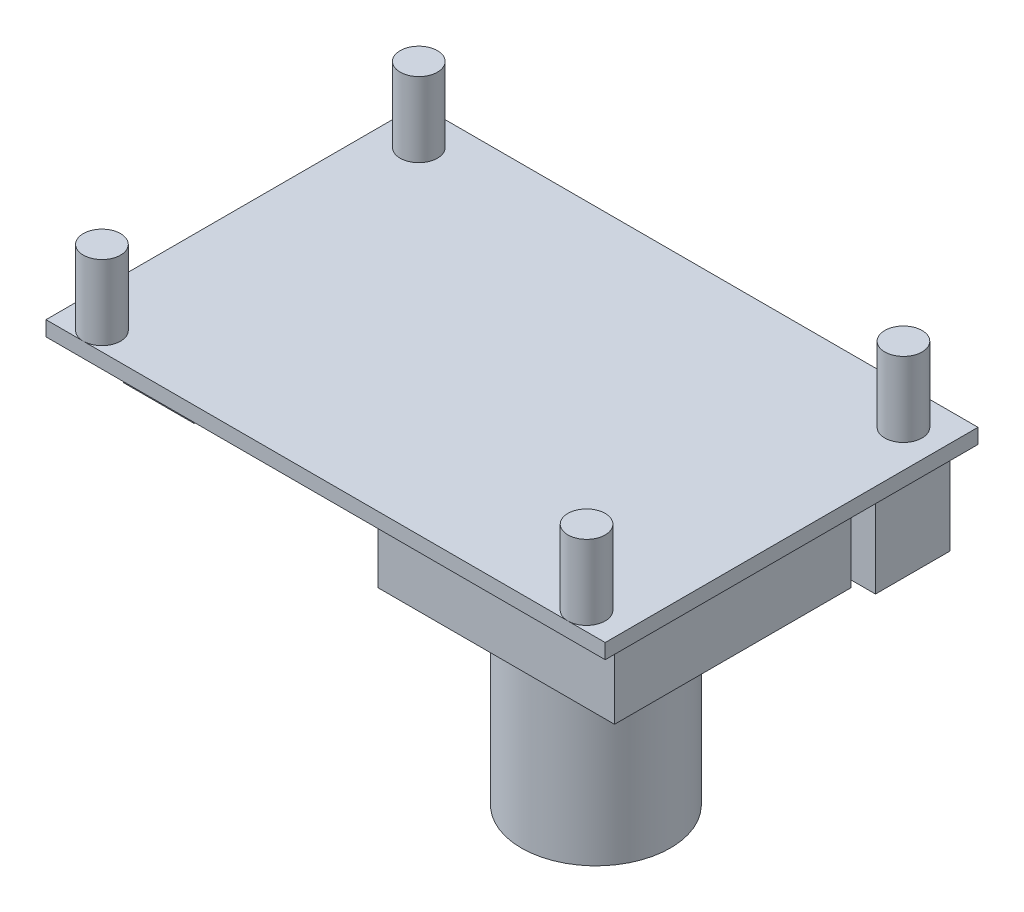
ISO-10303-21;
HEADER;
FILE_DESCRIPTION(('STEP AP214'),'2;1');
FILE_NAME('part.step','',(''),(''),'','','');
FILE_SCHEMA(('AUTOMOTIVE_DESIGN { 1 0 10303 214 1 1 1 1 }'));
ENDSEC;
DATA;
#1=APPLICATION_CONTEXT('core data for automotive mechanical design processes');
#2=APPLICATION_PROTOCOL_DEFINITION('international standard','automotive_design',2000,#1);
#3=PRODUCT_CONTEXT('',#1,'mechanical');
#4=PRODUCT('Part','Part','',(#3));
#5=PRODUCT_RELATED_PRODUCT_CATEGORY('part','',(#4));
#6=PRODUCT_DEFINITION_FORMATION('','',#4);
#7=PRODUCT_DEFINITION_CONTEXT('part definition',#1,'design');
#8=PRODUCT_DEFINITION('design','',#6,#7);
#9=PRODUCT_DEFINITION_SHAPE('','',#8);
#10=(LENGTH_UNIT() NAMED_UNIT(*) SI_UNIT(.MILLI.,.METRE.));
#11=(NAMED_UNIT(*) PLANE_ANGLE_UNIT() SI_UNIT($,.RADIAN.));
#12=(NAMED_UNIT(*) SI_UNIT($,.STERADIAN.) SOLID_ANGLE_UNIT());
#13=UNCERTAINTY_MEASURE_WITH_UNIT(LENGTH_MEASURE(1.E-05),#10,'distance_accuracy_value','');
#14=(GEOMETRIC_REPRESENTATION_CONTEXT(3) GLOBAL_UNCERTAINTY_ASSIGNED_CONTEXT((#13)) GLOBAL_UNIT_ASSIGNED_CONTEXT((#10,
#11,#12)) REPRESENTATION_CONTEXT('',''));
#15=CARTESIAN_POINT('',(0.,0.,0.));
#16=DIRECTION('',(0.,0.,1.));
#17=DIRECTION('',(1.,0.,0.));
#18=AXIS2_PLACEMENT_3D('',#15,#16,#17);
#19=CARTESIAN_POINT('',(-28.,27.,16.));
#20=DIRECTION('',(0.,0.,-1.));
#21=DIRECTION('',(-1.,0.,0.));
#22=AXIS2_PLACEMENT_3D('',#19,#20,#21);
#23=PLANE('',#22);
#24=DIRECTION('',(0.,-1.,0.));
#25=VECTOR('',#24,1.);
#26=CARTESIAN_POINT('',(-24.,27.,16.));
#27=LINE('',#26,#25);
#28=CARTESIAN_POINT('',(-24.,27.,16.));
#29=VERTEX_POINT('',#28);
#30=CARTESIAN_POINT('',(-24.,24.6,16.));
#31=VERTEX_POINT('',#30);
#32=EDGE_CURVE('E51',#29,#31,#27,.T.);
#33=ORIENTED_EDGE('',*,*,#32,.F.);
#34=DIRECTION('',(1.,0.,0.));
#35=VECTOR('',#34,1.);
#36=CARTESIAN_POINT('',(-28.,27.,16.));
#37=LINE('',#36,#35);
#38=CARTESIAN_POINT('',(-28.,27.,16.));
#39=VERTEX_POINT('',#38);
#40=EDGE_CURVE('E332',#39,#29,#37,.T.);
#41=ORIENTED_EDGE('',*,*,#40,.F.);
#42=DIRECTION('',(0.,-1.,0.));
#43=VECTOR('',#42,1.);
#44=CARTESIAN_POINT('',(-28.,27.,16.));
#45=LINE('',#44,#43);
#46=CARTESIAN_POINT('',(-28.,24.3,16.));
#47=VERTEX_POINT('',#46);
#48=EDGE_CURVE('E352',#39,#47,#45,.T.);
#49=ORIENTED_EDGE('',*,*,#48,.T.);
#50=DIRECTION('',(1.,0.,0.));
#51=VECTOR('',#50,1.);
#52=CARTESIAN_POINT('',(-28.,24.3,16.));
#53=LINE('',#52,#51);
#54=CARTESIAN_POINT('',(-5.1,24.3,16.));
#55=VERTEX_POINT('',#54);
#56=EDGE_CURVE('E345',#47,#55,#53,.T.);
#57=ORIENTED_EDGE('',*,*,#56,.T.);
#58=DIRECTION('',(0.,-1.,0.));
#59=VECTOR('',#58,1.);
#60=CARTESIAN_POINT('',(-5.1,27.,16.));
#61=LINE('',#60,#59);
#62=CARTESIAN_POINT('',(-5.1,27.,16.));
#63=VERTEX_POINT('',#62);
#64=EDGE_CURVE('E355',#63,#55,#61,.T.);
#65=ORIENTED_EDGE('',*,*,#64,.F.);
#66=CARTESIAN_POINT('',(-16.4,27.,16.));
#67=VERTEX_POINT('',#66);
#68=EDGE_CURVE('E328',#67,#63,#37,.T.);
#69=ORIENTED_EDGE('',*,*,#68,.F.);
#70=DIRECTION('',(0.,1.,0.));
#71=VECTOR('',#70,1.);
#72=CARTESIAN_POINT('',(-16.4,27.,16.));
#73=LINE('',#72,#71);
#74=CARTESIAN_POINT('',(-16.4,24.6,16.));
#75=VERTEX_POINT('',#74);
#76=EDGE_CURVE('E413',#75,#67,#73,.T.);
#77=ORIENTED_EDGE('',*,*,#76,.F.);
#78=DIRECTION('',(1.,0.,0.));
#79=VECTOR('',#78,1.);
#80=CARTESIAN_POINT('',(-28.,24.6,16.));
#81=LINE('',#80,#79);
#82=EDGE_CURVE('E412',#31,#75,#81,.T.);
#83=ORIENTED_EDGE('',*,*,#82,.F.);
#84=EDGE_LOOP('',(#33,#41,#49,#57,#65,#69,#77,#83));
#85=FACE_BOUND('',#84,.T.);
#86=ADVANCED_FACE('F43',(#85),#23,.F.);
#87=CARTESIAN_POINT('',(0.,27.,0.));
#88=DIRECTION('',(0.,1.,0.));
#89=DIRECTION('',(0.,0.,1.));
#90=AXIS2_PLACEMENT_3D('',#87,#88,#89);
#91=PLANE('',#90);
#92=ORIENTED_EDGE('',*,*,#40,.T.);
#93=DIRECTION('',(0.,0.,1.));
#94=VECTOR('',#93,1.);
#95=CARTESIAN_POINT('',(-24.,27.,5.));
#96=LINE('',#95,#94);
#97=CARTESIAN_POINT('',(-24.,27.,17.7));
#98=VERTEX_POINT('',#97);
#99=EDGE_CURVE('E59',#29,#98,#96,.T.);
#100=ORIENTED_EDGE('',*,*,#99,.T.);
#101=DIRECTION('',(1.,0.,0.));
#102=VECTOR('',#101,1.);
#103=CARTESIAN_POINT('',(-24.,27.,17.7));
#104=LINE('',#103,#102);
#105=CARTESIAN_POINT('',(-16.4,27.,17.7));
#106=VERTEX_POINT('',#105);
#107=EDGE_CURVE('E65',#98,#106,#104,.T.);
#108=ORIENTED_EDGE('',*,*,#107,.T.);
#109=DIRECTION('',(0.,0.,-1.));
#110=VECTOR('',#109,1.);
#111=CARTESIAN_POINT('',(-16.4,27.,17.7));
#112=LINE('',#111,#110);
#113=EDGE_CURVE('E231',#106,#67,#112,.T.);
#114=ORIENTED_EDGE('',*,*,#113,.T.);
#115=ORIENTED_EDGE('',*,*,#68,.T.);
#116=DIRECTION('',(0.,0.,-1.));
#117=VECTOR('',#116,1.);
#118=CARTESIAN_POINT('',(-5.1,27.,16.));
#119=LINE('',#118,#117);
#120=CARTESIAN_POINT('',(-5.1,27.,-7.));
#121=VERTEX_POINT('',#120);
#122=EDGE_CURVE('E334',#63,#121,#119,.T.);
#123=ORIENTED_EDGE('',*,*,#122,.T.);
#124=DIRECTION('',(-1.,0.,0.));
#125=VECTOR('',#124,1.);
#126=CARTESIAN_POINT('',(-5.1,27.,-7.));
#127=LINE('',#126,#125);
#128=CARTESIAN_POINT('',(-28.,27.,-7.));
#129=VERTEX_POINT('',#128);
#130=EDGE_CURVE('E338',#121,#129,#127,.T.);
#131=ORIENTED_EDGE('',*,*,#130,.T.);
#132=DIRECTION('',(0.,0.,1.));
#133=VECTOR('',#132,1.);
#134=CARTESIAN_POINT('',(-28.,27.,-7.));
#135=LINE('',#134,#133);
#136=EDGE_CURVE('E326',#129,#39,#135,.T.);
#137=ORIENTED_EDGE('',*,*,#136,.T.);
#138=EDGE_LOOP('',(#92,#100,#108,#114,#115,#123,#131,#137));
#139=FACE_BOUND('',#138,.T.);
#140=DIRECTION('',(0.,0.,1.));
#141=VECTOR('',#140,1.);
#142=CARTESIAN_POINT('',(1.6,27.,-9.4));
#143=LINE('',#142,#141);
#144=CARTESIAN_POINT('',(1.6,27.,-9.4));
#145=VERTEX_POINT('',#144);
#146=CARTESIAN_POINT('',(1.6,27.,16.));
#147=VERTEX_POINT('',#146);
#148=EDGE_CURVE('E262',#145,#147,#143,.T.);
#149=ORIENTED_EDGE('',*,*,#148,.T.);
#150=DIRECTION('',(1.,0.,0.));
#151=VECTOR('',#150,1.);
#152=CARTESIAN_POINT('',(1.6,27.,16.));
#153=LINE('',#152,#151);
#154=CARTESIAN_POINT('',(27.,27.,16.));
#155=VERTEX_POINT('',#154);
#156=EDGE_CURVE('E266',#147,#155,#153,.T.);
#157=ORIENTED_EDGE('',*,*,#156,.T.);
#158=DIRECTION('',(0.,0.,-1.));
#159=VECTOR('',#158,1.);
#160=CARTESIAN_POINT('',(27.,27.,16.));
#161=LINE('',#160,#159);
#162=CARTESIAN_POINT('',(27.,27.,-9.4));
#163=VERTEX_POINT('',#162);
#164=EDGE_CURVE('E267',#155,#163,#161,.T.);
#165=ORIENTED_EDGE('',*,*,#164,.T.);
#166=DIRECTION('',(-1.,0.,0.));
#167=VECTOR('',#166,1.);
#168=CARTESIAN_POINT('',(27.,27.,-9.4));
#169=LINE('',#168,#167);
#170=EDGE_CURVE('E271',#163,#145,#169,.T.);
#171=ORIENTED_EDGE('',*,*,#170,.T.);
#172=EDGE_LOOP('',(#149,#157,#165,#171));
#173=FACE_BOUND('',#172,.T.);
#174=DIRECTION('',(0.,0.,1.));
#175=VECTOR('',#174,1.);
#176=CARTESIAN_POINT('',(-30.,27.,-20.));
#177=LINE('',#176,#175);
#178=CARTESIAN_POINT('',(-30.,27.,-20.));
#179=VERTEX_POINT('',#178);
#180=CARTESIAN_POINT('',(-30.,27.,20.));
#181=VERTEX_POINT('',#180);
#182=EDGE_CURVE('E373',#179,#181,#177,.T.);
#183=ORIENTED_EDGE('',*,*,#182,.F.);
#184=DIRECTION('',(-1.,0.,0.));
#185=VECTOR('',#184,1.);
#186=CARTESIAN_POINT('',(30.,27.,-20.));
#187=LINE('',#186,#185);
#188=CARTESIAN_POINT('',(30.,27.,-20.));
#189=VERTEX_POINT('',#188);
#190=EDGE_CURVE('E379',#189,#179,#187,.T.);
#191=ORIENTED_EDGE('',*,*,#190,.F.);
#192=DIRECTION('',(0.,0.,-1.));
#193=VECTOR('',#192,1.);
#194=CARTESIAN_POINT('',(30.,27.,20.));
#195=LINE('',#194,#193);
#196=CARTESIAN_POINT('',(30.,27.,20.));
#197=VERTEX_POINT('',#196);
#198=EDGE_CURVE('E391',#197,#189,#195,.T.);
#199=ORIENTED_EDGE('',*,*,#198,.F.);
#200=DIRECTION('',(1.,0.,0.));
#201=VECTOR('',#200,1.);
#202=CARTESIAN_POINT('',(-30.,27.,20.));
#203=LINE('',#202,#201);
#204=EDGE_CURVE('E393',#181,#197,#203,.T.);
#205=ORIENTED_EDGE('',*,*,#204,.F.);
#206=EDGE_LOOP('',(#183,#191,#199,#205));
#207=FACE_BOUND('',#206,.T.);
#208=DIRECTION('',(0.,0.,1.));
#209=VECTOR('',#208,1.);
#210=CARTESIAN_POINT('',(-28.,27.,-19.));
#211=LINE('',#210,#209);
#212=CARTESIAN_POINT('',(-28.,27.,-19.));
#213=VERTEX_POINT('',#212);
#214=CARTESIAN_POINT('',(-28.,27.,-11.));
#215=VERTEX_POINT('',#214);
#216=EDGE_CURVE('E236',#213,#215,#211,.T.);
#217=ORIENTED_EDGE('',*,*,#216,.T.);
#218=DIRECTION('',(1.,0.,0.));
#219=VECTOR('',#218,1.);
#220=CARTESIAN_POINT('',(-28.,27.,-11.));
#221=LINE('',#220,#219);
#222=CARTESIAN_POINT('',(28.,27.,-11.));
#223=VERTEX_POINT('',#222);
#224=EDGE_CURVE('E238',#215,#223,#221,.T.);
#225=ORIENTED_EDGE('',*,*,#224,.T.);
#226=DIRECTION('',(0.,0.,-1.));
#227=VECTOR('',#226,1.);
#228=CARTESIAN_POINT('',(28.,27.,-11.));
#229=LINE('',#228,#227);
#230=CARTESIAN_POINT('',(28.,27.,-19.));
#231=VERTEX_POINT('',#230);
#232=EDGE_CURVE('E241',#223,#231,#229,.T.);
#233=ORIENTED_EDGE('',*,*,#232,.T.);
#234=DIRECTION('',(-1.,0.,0.));
#235=VECTOR('',#234,1.);
#236=CARTESIAN_POINT('',(28.,27.,-19.));
#237=LINE('',#236,#235);
#238=EDGE_CURVE('E242',#231,#213,#237,.T.);
#239=ORIENTED_EDGE('',*,*,#238,.T.);
#240=EDGE_LOOP('',(#217,#225,#233,#239));
#241=FACE_BOUND('',#240,.T.);
#242=ADVANCED_FACE('F424',(#139,#173,#207,#241),#91,.F.);
#243=CARTESIAN_POINT('',(-26.,36.6,18.));
#244=DIRECTION('',(0.,-1.,0.));
#245=DIRECTION('',(0.,0.,-1.));
#246=AXIS2_PLACEMENT_3D('',#243,#244,#245);
#247=CYLINDRICAL_SURFACE('',#246,2.);
#248=CARTESIAN_POINT('',(-26.,36.6,18.));
#249=DIRECTION('',(0.,1.,0.));
#250=DIRECTION('',(0.,0.,1.));
#251=AXIS2_PLACEMENT_3D('',#248,#249,#250);
#252=CIRCLE('',#251,2.);
#253=CARTESIAN_POINT('',(-26.,36.6,20.));
#254=VERTEX_POINT('',#253);
#255=EDGE_CURVE('E406',#254,#254,#252,.T.);
#256=ORIENTED_EDGE('',*,*,#255,.F.);
#257=EDGE_LOOP('',(#256));
#258=FACE_BOUND('',#257,.T.);
#259=CARTESIAN_POINT('',(-26.,28.6,18.));
#260=DIRECTION('',(0.,1.,0.));
#261=DIRECTION('',(0.,0.,1.));
#262=AXIS2_PLACEMENT_3D('',#259,#260,#261);
#263=CIRCLE('',#262,2.);
#264=CARTESIAN_POINT('',(-26.,28.6,20.));
#265=VERTEX_POINT('',#264);
#266=EDGE_CURVE('E410',#265,#265,#263,.T.);
#267=ORIENTED_EDGE('',*,*,#266,.T.);
#268=EDGE_LOOP('',(#267));
#269=FACE_BOUND('',#268,.T.);
#270=ADVANCED_FACE('F44',(#258,#269),#247,.T.);
#271=CARTESIAN_POINT('',(-26.,36.6,18.));
#272=DIRECTION('',(0.,1.,0.));
#273=DIRECTION('',(0.,0.,1.));
#274=AXIS2_PLACEMENT_3D('',#271,#272,#273);
#275=PLANE('',#274);
#276=ORIENTED_EDGE('',*,*,#255,.T.);
#277=EDGE_LOOP('',(#276));
#278=FACE_BOUND('',#277,.T.);
#279=ADVANCED_FACE('F484',(#278),#275,.T.);
#280=CARTESIAN_POINT('',(0.,28.6,0.));
#281=DIRECTION('',(0.,1.,0.));
#282=DIRECTION('',(0.,0.,1.));
#283=AXIS2_PLACEMENT_3D('',#280,#281,#282);
#284=PLANE('',#283);
#285=CARTESIAN_POINT('',(26.,28.6,-16.));
#286=DIRECTION('',(0.,1.,0.));
#287=DIRECTION('',(0.,0.,1.));
#288=AXIS2_PLACEMENT_3D('',#285,#286,#287);
#289=CIRCLE('',#288,2.);
#290=CARTESIAN_POINT('',(26.,28.6,-14.));
#291=VERTEX_POINT('',#290);
#292=EDGE_CURVE('E359',#291,#291,#289,.T.);
#293=ORIENTED_EDGE('',*,*,#292,.F.);
#294=EDGE_LOOP('',(#293));
#295=FACE_BOUND('',#294,.T.);
#296=CARTESIAN_POINT('',(-26.,28.6,-16.));
#297=DIRECTION('',(0.,1.,0.));
#298=DIRECTION('',(0.,0.,1.));
#299=AXIS2_PLACEMENT_3D('',#296,#297,#298);
#300=CIRCLE('',#299,2.);
#301=CARTESIAN_POINT('',(-26.,28.6,-14.));
#302=VERTEX_POINT('',#301);
#303=EDGE_CURVE('E366',#302,#302,#300,.T.);
#304=ORIENTED_EDGE('',*,*,#303,.F.);
#305=EDGE_LOOP('',(#304));
#306=FACE_BOUND('',#305,.T.);
#307=DIRECTION('',(1.,0.,0.));
#308=VECTOR('',#307,1.);
#309=CARTESIAN_POINT('',(-30.,28.6,20.));
#310=LINE('',#309,#308);
#311=CARTESIAN_POINT('',(26.,28.6,20.));
#312=VERTEX_POINT('',#311);
#313=EDGE_CURVE('E383',#265,#312,#310,.T.);
#314=ORIENTED_EDGE('',*,*,#313,.T.);
#315=CARTESIAN_POINT('',(26.,28.6,18.));
#316=DIRECTION('',(0.,1.,0.));
#317=DIRECTION('',(0.,0.,1.));
#318=AXIS2_PLACEMENT_3D('',#315,#316,#317);
#319=CIRCLE('',#318,2.);
#320=EDGE_CURVE('E362',#312,#312,#319,.T.);
#321=ORIENTED_EDGE('',*,*,#320,.F.);
#322=CARTESIAN_POINT('',(30.,28.6,20.));
#323=VERTEX_POINT('',#322);
#324=EDGE_CURVE('E377',#312,#323,#310,.T.);
#325=ORIENTED_EDGE('',*,*,#324,.T.);
#326=DIRECTION('',(0.,0.,-1.));
#327=VECTOR('',#326,1.);
#328=CARTESIAN_POINT('',(30.,28.6,20.));
#329=LINE('',#328,#327);
#330=CARTESIAN_POINT('',(30.,28.6,-20.));
#331=VERTEX_POINT('',#330);
#332=EDGE_CURVE('E382',#323,#331,#329,.T.);
#333=ORIENTED_EDGE('',*,*,#332,.T.);
#334=DIRECTION('',(-1.,0.,0.));
#335=VECTOR('',#334,1.);
#336=CARTESIAN_POINT('',(30.,28.6,-20.));
#337=LINE('',#336,#335);
#338=CARTESIAN_POINT('',(-30.,28.6,-20.));
#339=VERTEX_POINT('',#338);
#340=EDGE_CURVE('E387',#331,#339,#337,.T.);
#341=ORIENTED_EDGE('',*,*,#340,.T.);
#342=DIRECTION('',(0.,0.,1.));
#343=VECTOR('',#342,1.);
#344=CARTESIAN_POINT('',(-30.,28.6,-20.));
#345=LINE('',#344,#343);
#346=CARTESIAN_POINT('',(-30.,28.6,20.));
#347=VERTEX_POINT('',#346);
#348=EDGE_CURVE('E376',#339,#347,#345,.T.);
#349=ORIENTED_EDGE('',*,*,#348,.T.);
#350=EDGE_CURVE('E381',#347,#265,#310,.T.);
#351=ORIENTED_EDGE('',*,*,#350,.T.);
#352=ORIENTED_EDGE('',*,*,#266,.F.);
#353=EDGE_LOOP('',(#314,#321,#325,#333,#341,#349,#351,#352));
#354=FACE_BOUND('',#353,.T.);
#355=ADVANCED_FACE('F485',(#295,#306,#354),#284,.T.);
#356=CARTESIAN_POINT('',(-30.,28.6,-20.));
#357=DIRECTION('',(1.,0.,0.));
#358=DIRECTION('',(0.,0.,-1.));
#359=AXIS2_PLACEMENT_3D('',#356,#357,#358);
#360=PLANE('',#359);
#361=ORIENTED_EDGE('',*,*,#182,.T.);
#362=DIRECTION('',(0.,-1.,0.));
#363=VECTOR('',#362,1.);
#364=CARTESIAN_POINT('',(-30.,28.6,20.));
#365=LINE('',#364,#363);
#366=EDGE_CURVE('E404',#347,#181,#365,.T.);
#367=ORIENTED_EDGE('',*,*,#366,.F.);
#368=ORIENTED_EDGE('',*,*,#348,.F.);
#369=DIRECTION('',(0.,-1.,0.));
#370=VECTOR('',#369,1.);
#371=CARTESIAN_POINT('',(-30.,28.6,-20.));
#372=LINE('',#371,#370);
#373=EDGE_CURVE('E389',#339,#179,#372,.T.);
#374=ORIENTED_EDGE('',*,*,#373,.T.);
#375=EDGE_LOOP('',(#361,#367,#368,#374));
#376=FACE_BOUND('',#375,.T.);
#377=ADVANCED_FACE('F482',(#376),#360,.F.);
#378=CARTESIAN_POINT('',(-30.,28.6,20.));
#379=DIRECTION('',(0.,0.,-1.));
#380=DIRECTION('',(-1.,0.,0.));
#381=AXIS2_PLACEMENT_3D('',#378,#379,#380);
#382=PLANE('',#381);
#383=ORIENTED_EDGE('',*,*,#204,.T.);
#384=DIRECTION('',(0.,-1.,0.));
#385=VECTOR('',#384,1.);
#386=CARTESIAN_POINT('',(30.,28.6,20.));
#387=LINE('',#386,#385);
#388=EDGE_CURVE('E402',#323,#197,#387,.T.);
#389=ORIENTED_EDGE('',*,*,#388,.F.);
#390=ORIENTED_EDGE('',*,*,#324,.F.);
#391=ORIENTED_EDGE('',*,*,#313,.F.);
#392=ORIENTED_EDGE('',*,*,#350,.F.);
#393=ORIENTED_EDGE('',*,*,#366,.T.);
#394=EDGE_LOOP('',(#383,#389,#390,#391,#392,#393));
#395=FACE_BOUND('',#394,.T.);
#396=ADVANCED_FACE('F493',(#395),#382,.F.);
#397=CARTESIAN_POINT('',(30.,28.6,20.));
#398=DIRECTION('',(-1.,0.,0.));
#399=DIRECTION('',(0.,0.,1.));
#400=AXIS2_PLACEMENT_3D('',#397,#398,#399);
#401=PLANE('',#400);
#402=ORIENTED_EDGE('',*,*,#198,.T.);
#403=DIRECTION('',(0.,-1.,0.));
#404=VECTOR('',#403,1.);
#405=CARTESIAN_POINT('',(30.,28.6,-20.));
#406=LINE('',#405,#404);
#407=EDGE_CURVE('E399',#331,#189,#406,.T.);
#408=ORIENTED_EDGE('',*,*,#407,.F.);
#409=ORIENTED_EDGE('',*,*,#332,.F.);
#410=ORIENTED_EDGE('',*,*,#388,.T.);
#411=EDGE_LOOP('',(#402,#408,#409,#410));
#412=FACE_BOUND('',#411,.T.);
#413=ADVANCED_FACE('F489',(#412),#401,.F.);
#414=CARTESIAN_POINT('',(30.,28.6,-20.));
#415=DIRECTION('',(0.,0.,1.));
#416=DIRECTION('',(1.,0.,0.));
#417=AXIS2_PLACEMENT_3D('',#414,#415,#416);
#418=PLANE('',#417);
#419=ORIENTED_EDGE('',*,*,#190,.T.);
#420=ORIENTED_EDGE('',*,*,#373,.F.);
#421=ORIENTED_EDGE('',*,*,#340,.F.);
#422=ORIENTED_EDGE('',*,*,#407,.T.);
#423=EDGE_LOOP('',(#419,#420,#421,#422));
#424=FACE_BOUND('',#423,.T.);
#425=ADVANCED_FACE('F477',(#424),#418,.F.);
#426=CARTESIAN_POINT('',(-26.,36.6,-16.));
#427=DIRECTION('',(0.,-1.,0.));
#428=DIRECTION('',(0.,0.,-1.));
#429=AXIS2_PLACEMENT_3D('',#426,#427,#428);
#430=CYLINDRICAL_SURFACE('',#429,2.);
#431=CARTESIAN_POINT('',(-26.,36.6,-16.));
#432=DIRECTION('',(0.,1.,0.));
#433=DIRECTION('',(0.,0.,1.));
#434=AXIS2_PLACEMENT_3D('',#431,#432,#433);
#435=CIRCLE('',#434,2.);
#436=CARTESIAN_POINT('',(-26.,36.6,-14.));
#437=VERTEX_POINT('',#436);
#438=EDGE_CURVE('E367',#437,#437,#435,.T.);
#439=ORIENTED_EDGE('',*,*,#438,.F.);
#440=EDGE_LOOP('',(#439));
#441=FACE_BOUND('',#440,.T.);
#442=ORIENTED_EDGE('',*,*,#303,.T.);
#443=EDGE_LOOP('',(#442));
#444=FACE_BOUND('',#443,.T.);
#445=ADVANCED_FACE('F478',(#441,#444),#430,.T.);
#446=CARTESIAN_POINT('',(-26.,36.6,-16.));
#447=DIRECTION('',(0.,1.,0.));
#448=DIRECTION('',(0.,0.,1.));
#449=AXIS2_PLACEMENT_3D('',#446,#447,#448);
#450=PLANE('',#449);
#451=ORIENTED_EDGE('',*,*,#438,.T.);
#452=EDGE_LOOP('',(#451));
#453=FACE_BOUND('',#452,.T.);
#454=ADVANCED_FACE('F472',(#453),#450,.T.);
#455=CARTESIAN_POINT('',(26.,36.6,18.));
#456=DIRECTION('',(0.,-1.,0.));
#457=DIRECTION('',(0.,0.,-1.));
#458=AXIS2_PLACEMENT_3D('',#455,#456,#457);
#459=CYLINDRICAL_SURFACE('',#458,2.);
#460=CARTESIAN_POINT('',(26.,36.6,18.));
#461=DIRECTION('',(0.,1.,0.));
#462=DIRECTION('',(0.,0.,1.));
#463=AXIS2_PLACEMENT_3D('',#460,#461,#462);
#464=CIRCLE('',#463,2.);
#465=CARTESIAN_POINT('',(26.,36.6,20.));
#466=VERTEX_POINT('',#465);
#467=EDGE_CURVE('E364',#466,#466,#464,.T.);
#468=ORIENTED_EDGE('',*,*,#467,.F.);
#469=EDGE_LOOP('',(#468));
#470=FACE_BOUND('',#469,.T.);
#471=ORIENTED_EDGE('',*,*,#320,.T.);
#472=EDGE_LOOP('',(#471));
#473=FACE_BOUND('',#472,.T.);
#474=ADVANCED_FACE('F469',(#470,#473),#459,.T.);
#475=CARTESIAN_POINT('',(26.,36.6,18.));
#476=DIRECTION('',(0.,1.,0.));
#477=DIRECTION('',(0.,0.,1.));
#478=AXIS2_PLACEMENT_3D('',#475,#476,#477);
#479=PLANE('',#478);
#480=ORIENTED_EDGE('',*,*,#467,.T.);
#481=EDGE_LOOP('',(#480));
#482=FACE_BOUND('',#481,.T.);
#483=ADVANCED_FACE('F464',(#482),#479,.T.);
#484=CARTESIAN_POINT('',(26.,36.6,-16.));
#485=DIRECTION('',(0.,-1.,0.));
#486=DIRECTION('',(0.,0.,-1.));
#487=AXIS2_PLACEMENT_3D('',#484,#485,#486);
#488=CYLINDRICAL_SURFACE('',#487,2.);
#489=CARTESIAN_POINT('',(26.,36.6,-16.));
#490=DIRECTION('',(0.,1.,0.));
#491=DIRECTION('',(0.,0.,1.));
#492=AXIS2_PLACEMENT_3D('',#489,#490,#491);
#493=CIRCLE('',#492,2.);
#494=CARTESIAN_POINT('',(26.,36.6,-14.));
#495=VERTEX_POINT('',#494);
#496=EDGE_CURVE('E356',#495,#495,#493,.T.);
#497=ORIENTED_EDGE('',*,*,#496,.F.);
#498=EDGE_LOOP('',(#497));
#499=FACE_BOUND('',#498,.T.);
#500=ORIENTED_EDGE('',*,*,#292,.T.);
#501=EDGE_LOOP('',(#500));
#502=FACE_BOUND('',#501,.T.);
#503=ADVANCED_FACE('F458',(#499,#502),#488,.T.);
#504=CARTESIAN_POINT('',(26.,36.6,-16.));
#505=DIRECTION('',(0.,1.,0.));
#506=DIRECTION('',(0.,0.,1.));
#507=AXIS2_PLACEMENT_3D('',#504,#505,#506);
#508=PLANE('',#507);
#509=ORIENTED_EDGE('',*,*,#496,.T.);
#510=EDGE_LOOP('',(#509));
#511=FACE_BOUND('',#510,.T.);
#512=ADVANCED_FACE('F457',(#511),#508,.T.);
#513=CARTESIAN_POINT('',(-28.,27.,-7.));
#514=DIRECTION('',(1.,0.,0.));
#515=DIRECTION('',(0.,0.,-1.));
#516=AXIS2_PLACEMENT_3D('',#513,#514,#515);
#517=PLANE('',#516);
#518=DIRECTION('',(0.,0.,1.));
#519=VECTOR('',#518,1.);
#520=CARTESIAN_POINT('',(-28.,24.3,-7.));
#521=LINE('',#520,#519);
#522=CARTESIAN_POINT('',(-28.,24.3,-7.));
#523=VERTEX_POINT('',#522);
#524=EDGE_CURVE('E324',#523,#47,#521,.T.);
#525=ORIENTED_EDGE('',*,*,#524,.T.);
#526=ORIENTED_EDGE('',*,*,#48,.F.);
#527=ORIENTED_EDGE('',*,*,#136,.F.);
#528=DIRECTION('',(0.,-1.,0.));
#529=VECTOR('',#528,1.);
#530=CARTESIAN_POINT('',(-28.,27.,-7.));
#531=LINE('',#530,#529);
#532=EDGE_CURVE('E339',#129,#523,#531,.T.);
#533=ORIENTED_EDGE('',*,*,#532,.T.);
#534=EDGE_LOOP('',(#525,#526,#527,#533));
#535=FACE_BOUND('',#534,.T.);
#536=ADVANCED_FACE('F454',(#535),#517,.F.);
#537=CARTESIAN_POINT('',(-5.1,27.,16.));
#538=DIRECTION('',(-1.,0.,0.));
#539=DIRECTION('',(0.,0.,1.));
#540=AXIS2_PLACEMENT_3D('',#537,#538,#539);
#541=PLANE('',#540);
#542=DIRECTION('',(0.,0.,-1.));
#543=VECTOR('',#542,1.);
#544=CARTESIAN_POINT('',(-5.1,24.3,16.));
#545=LINE('',#544,#543);
#546=CARTESIAN_POINT('',(-5.1,24.3,-7.));
#547=VERTEX_POINT('',#546);
#548=EDGE_CURVE('E341',#55,#547,#545,.T.);
#549=ORIENTED_EDGE('',*,*,#548,.T.);
#550=DIRECTION('',(0.,-1.,0.));
#551=VECTOR('',#550,1.);
#552=CARTESIAN_POINT('',(-5.1,27.,-7.));
#553=LINE('',#552,#551);
#554=EDGE_CURVE('E349',#121,#547,#553,.T.);
#555=ORIENTED_EDGE('',*,*,#554,.F.);
#556=ORIENTED_EDGE('',*,*,#122,.F.);
#557=ORIENTED_EDGE('',*,*,#64,.T.);
#558=EDGE_LOOP('',(#549,#555,#556,#557));
#559=FACE_BOUND('',#558,.T.);
#560=ADVANCED_FACE('F452',(#559),#541,.F.);
#561=CARTESIAN_POINT('',(-5.1,27.,-7.));
#562=DIRECTION('',(0.,0.,1.));
#563=DIRECTION('',(1.,0.,0.));
#564=AXIS2_PLACEMENT_3D('',#561,#562,#563);
#565=PLANE('',#564);
#566=DIRECTION('',(-1.,0.,0.));
#567=VECTOR('',#566,1.);
#568=CARTESIAN_POINT('',(-5.1,24.3,-7.));
#569=LINE('',#568,#567);
#570=EDGE_CURVE('E329',#547,#523,#569,.T.);
#571=ORIENTED_EDGE('',*,*,#570,.T.);
#572=ORIENTED_EDGE('',*,*,#532,.F.);
#573=ORIENTED_EDGE('',*,*,#130,.F.);
#574=ORIENTED_EDGE('',*,*,#554,.T.);
#575=EDGE_LOOP('',(#571,#572,#573,#574));
#576=FACE_BOUND('',#575,.T.);
#577=ADVANCED_FACE('F603',(#576),#565,.F.);
#578=CARTESIAN_POINT('',(0.,24.3,0.));
#579=DIRECTION('',(0.,1.,0.));
#580=DIRECTION('',(0.,0.,1.));
#581=AXIS2_PLACEMENT_3D('',#578,#579,#580);
#582=PLANE('',#581);
#583=DIRECTION('',(-1.,0.,0.));
#584=VECTOR('',#583,1.);
#585=CARTESIAN_POINT('',(-15.,24.3,-5.));
#586=LINE('',#585,#584);
#587=CARTESIAN_POINT('',(-15.,24.3,-5.));
#588=VERTEX_POINT('',#587);
#589=CARTESIAN_POINT('',(-25.,24.3,-5.));
#590=VERTEX_POINT('',#589);
#591=EDGE_CURVE('E304',#588,#590,#586,.T.);
#592=ORIENTED_EDGE('',*,*,#591,.T.);
#593=DIRECTION('',(0.,0.,1.));
#594=VECTOR('',#593,1.);
#595=CARTESIAN_POINT('',(-25.,24.3,-5.));
#596=LINE('',#595,#594);
#597=CARTESIAN_POINT('',(-25.,24.3,3.));
#598=VERTEX_POINT('',#597);
#599=EDGE_CURVE('E291',#590,#598,#596,.T.);
#600=ORIENTED_EDGE('',*,*,#599,.T.);
#601=DIRECTION('',(1.,0.,0.));
#602=VECTOR('',#601,1.);
#603=CARTESIAN_POINT('',(-25.,24.3,3.));
#604=LINE('',#603,#602);
#605=CARTESIAN_POINT('',(-15.,24.3,3.));
#606=VERTEX_POINT('',#605);
#607=EDGE_CURVE('E298',#598,#606,#604,.T.);
#608=ORIENTED_EDGE('',*,*,#607,.T.);
#609=DIRECTION('',(0.,0.,-1.));
#610=VECTOR('',#609,1.);
#611=CARTESIAN_POINT('',(-15.,24.3,3.));
#612=LINE('',#611,#610);
#613=EDGE_CURVE('E297',#606,#588,#612,.T.);
#614=ORIENTED_EDGE('',*,*,#613,.T.);
#615=EDGE_LOOP('',(#592,#600,#608,#614));
#616=FACE_BOUND('',#615,.T.);
#617=ORIENTED_EDGE('',*,*,#524,.F.);
#618=ORIENTED_EDGE('',*,*,#570,.F.);
#619=ORIENTED_EDGE('',*,*,#548,.F.);
#620=ORIENTED_EDGE('',*,*,#56,.F.);
#621=EDGE_LOOP('',(#617,#618,#619,#620));
#622=FACE_BOUND('',#621,.T.);
#623=ADVANCED_FACE('F601',(#616,#622),#582,.F.);
#624=CARTESIAN_POINT('',(-25.,24.3,-5.));
#625=DIRECTION('',(1.,0.,0.));
#626=DIRECTION('',(0.,0.,-1.));
#627=AXIS2_PLACEMENT_3D('',#624,#625,#626);
#628=PLANE('',#627);
#629=DIRECTION('',(0.,0.,1.));
#630=VECTOR('',#629,1.);
#631=CARTESIAN_POINT('',(-25.,14.3,-5.));
#632=LINE('',#631,#630);
#633=CARTESIAN_POINT('',(-25.,14.3,-5.));
#634=VERTEX_POINT('',#633);
#635=CARTESIAN_POINT('',(-25.,14.3,3.));
#636=VERTEX_POINT('',#635);
#637=EDGE_CURVE('E295',#634,#636,#632,.T.);
#638=ORIENTED_EDGE('',*,*,#637,.T.);
#639=DIRECTION('',(0.,-1.,0.));
#640=VECTOR('',#639,1.);
#641=CARTESIAN_POINT('',(-25.,24.3,3.));
#642=LINE('',#641,#640);
#643=EDGE_CURVE('E325',#598,#636,#642,.T.);
#644=ORIENTED_EDGE('',*,*,#643,.F.);
#645=ORIENTED_EDGE('',*,*,#599,.F.);
#646=DIRECTION('',(0.,-1.,0.));
#647=VECTOR('',#646,1.);
#648=CARTESIAN_POINT('',(-25.,24.3,-5.));
#649=LINE('',#648,#647);
#650=EDGE_CURVE('E308',#590,#634,#649,.T.);
#651=ORIENTED_EDGE('',*,*,#650,.T.);
#652=EDGE_LOOP('',(#638,#644,#645,#651));
#653=FACE_BOUND('',#652,.T.);
#654=ADVANCED_FACE('F600',(#653),#628,.F.);
#655=CARTESIAN_POINT('',(-25.,24.3,3.));
#656=DIRECTION('',(0.,0.,-1.));
#657=DIRECTION('',(-1.,0.,0.));
#658=AXIS2_PLACEMENT_3D('',#655,#656,#657);
#659=PLANE('',#658);
#660=DIRECTION('',(1.,0.,0.));
#661=VECTOR('',#660,1.);
#662=CARTESIAN_POINT('',(-25.,14.3,3.));
#663=LINE('',#662,#661);
#664=CARTESIAN_POINT('',(-15.,14.3,3.));
#665=VERTEX_POINT('',#664);
#666=EDGE_CURVE('E310',#636,#665,#663,.T.);
#667=ORIENTED_EDGE('',*,*,#666,.T.);
#668=DIRECTION('',(0.,-1.,0.));
#669=VECTOR('',#668,1.);
#670=CARTESIAN_POINT('',(-15.,24.3,3.));
#671=LINE('',#670,#669);
#672=EDGE_CURVE('E317',#606,#665,#671,.T.);
#673=ORIENTED_EDGE('',*,*,#672,.F.);
#674=ORIENTED_EDGE('',*,*,#607,.F.);
#675=ORIENTED_EDGE('',*,*,#643,.T.);
#676=EDGE_LOOP('',(#667,#673,#674,#675));
#677=FACE_BOUND('',#676,.T.);
#678=ADVANCED_FACE('F593',(#677),#659,.F.);
#679=CARTESIAN_POINT('',(-15.,24.3,3.));
#680=DIRECTION('',(-1.,0.,0.));
#681=DIRECTION('',(0.,0.,1.));
#682=AXIS2_PLACEMENT_3D('',#679,#680,#681);
#683=PLANE('',#682);
#684=DIRECTION('',(0.,0.,-1.));
#685=VECTOR('',#684,1.);
#686=CARTESIAN_POINT('',(-15.,14.3,3.));
#687=LINE('',#686,#685);
#688=CARTESIAN_POINT('',(-15.,14.3,-5.));
#689=VERTEX_POINT('',#688);
#690=EDGE_CURVE('E313',#665,#689,#687,.T.);
#691=ORIENTED_EDGE('',*,*,#690,.T.);
#692=DIRECTION('',(0.,-1.,0.));
#693=VECTOR('',#692,1.);
#694=CARTESIAN_POINT('',(-15.,24.3,-5.));
#695=LINE('',#694,#693);
#696=EDGE_CURVE('E316',#588,#689,#695,.T.);
#697=ORIENTED_EDGE('',*,*,#696,.F.);
#698=ORIENTED_EDGE('',*,*,#613,.F.);
#699=ORIENTED_EDGE('',*,*,#672,.T.);
#700=EDGE_LOOP('',(#691,#697,#698,#699));
#701=FACE_BOUND('',#700,.T.);
#702=ADVANCED_FACE('F589',(#701),#683,.F.);
#703=CARTESIAN_POINT('',(-15.,24.3,-5.));
#704=DIRECTION('',(0.,0.,1.));
#705=DIRECTION('',(1.,0.,0.));
#706=AXIS2_PLACEMENT_3D('',#703,#704,#705);
#707=PLANE('',#706);
#708=DIRECTION('',(-1.,0.,0.));
#709=VECTOR('',#708,1.);
#710=CARTESIAN_POINT('',(-15.,14.3,-5.));
#711=LINE('',#710,#709);
#712=EDGE_CURVE('E300',#689,#634,#711,.T.);
#713=ORIENTED_EDGE('',*,*,#712,.T.);
#714=ORIENTED_EDGE('',*,*,#650,.F.);
#715=ORIENTED_EDGE('',*,*,#591,.F.);
#716=ORIENTED_EDGE('',*,*,#696,.T.);
#717=EDGE_LOOP('',(#713,#714,#715,#716));
#718=FACE_BOUND('',#717,.T.);
#719=ADVANCED_FACE('F584',(#718),#707,.F.);
#720=CARTESIAN_POINT('',(0.,14.3,0.));
#721=DIRECTION('',(0.,1.,0.));
#722=DIRECTION('',(0.,0.,1.));
#723=AXIS2_PLACEMENT_3D('',#720,#721,#722);
#724=PLANE('',#723);
#725=ORIENTED_EDGE('',*,*,#637,.F.);
#726=ORIENTED_EDGE('',*,*,#712,.F.);
#727=ORIENTED_EDGE('',*,*,#690,.F.);
#728=ORIENTED_EDGE('',*,*,#666,.F.);
#729=EDGE_LOOP('',(#725,#726,#727,#728));
#730=FACE_BOUND('',#729,.T.);
#731=ADVANCED_FACE('F583',(#730),#724,.F.);
#732=CARTESIAN_POINT('',(1.6,27.,-9.4));
#733=DIRECTION('',(1.,0.,0.));
#734=DIRECTION('',(0.,0.,-1.));
#735=AXIS2_PLACEMENT_3D('',#732,#733,#734);
#736=PLANE('',#735);
#737=DIRECTION('',(0.,0.,1.));
#738=VECTOR('',#737,1.);
#739=CARTESIAN_POINT('',(1.6,17.5,-9.4));
#740=LINE('',#739,#738);
#741=CARTESIAN_POINT('',(1.6,17.5,-9.4));
#742=VERTEX_POINT('',#741);
#743=CARTESIAN_POINT('',(1.6,17.5,16.));
#744=VERTEX_POINT('',#743);
#745=EDGE_CURVE('E263',#742,#744,#740,.T.);
#746=ORIENTED_EDGE('',*,*,#745,.T.);
#747=DIRECTION('',(0.,-1.,0.));
#748=VECTOR('',#747,1.);
#749=CARTESIAN_POINT('',(1.6,27.,16.));
#750=LINE('',#749,#748);
#751=EDGE_CURVE('E286',#147,#744,#750,.T.);
#752=ORIENTED_EDGE('',*,*,#751,.F.);
#753=ORIENTED_EDGE('',*,*,#148,.F.);
#754=DIRECTION('',(0.,-1.,0.));
#755=VECTOR('',#754,1.);
#756=CARTESIAN_POINT('',(1.6,27.,-9.4));
#757=LINE('',#756,#755);
#758=EDGE_CURVE('E272',#145,#742,#757,.T.);
#759=ORIENTED_EDGE('',*,*,#758,.T.);
#760=EDGE_LOOP('',(#746,#752,#753,#759));
#761=FACE_BOUND('',#760,.T.);
#762=ADVANCED_FACE('F580',(#761),#736,.F.);
#763=CARTESIAN_POINT('',(1.6,27.,16.));
#764=DIRECTION('',(0.,0.,-1.));
#765=DIRECTION('',(-1.,0.,0.));
#766=AXIS2_PLACEMENT_3D('',#763,#764,#765);
#767=PLANE('',#766);
#768=DIRECTION('',(1.,0.,0.));
#769=VECTOR('',#768,1.);
#770=CARTESIAN_POINT('',(1.6,17.5,16.));
#771=LINE('',#770,#769);
#772=CARTESIAN_POINT('',(27.,17.5,16.));
#773=VERTEX_POINT('',#772);
#774=EDGE_CURVE('E277',#744,#773,#771,.T.);
#775=ORIENTED_EDGE('',*,*,#774,.T.);
#776=DIRECTION('',(0.,-1.,0.));
#777=VECTOR('',#776,1.);
#778=CARTESIAN_POINT('',(27.,27.,16.));
#779=LINE('',#778,#777);
#780=EDGE_CURVE('E287',#155,#773,#779,.T.);
#781=ORIENTED_EDGE('',*,*,#780,.F.);
#782=ORIENTED_EDGE('',*,*,#156,.F.);
#783=ORIENTED_EDGE('',*,*,#751,.T.);
#784=EDGE_LOOP('',(#775,#781,#782,#783));
#785=FACE_BOUND('',#784,.T.);
#786=ADVANCED_FACE('F571',(#785),#767,.F.);
#787=CARTESIAN_POINT('',(27.,27.,16.));
#788=DIRECTION('',(-1.,0.,0.));
#789=DIRECTION('',(0.,0.,1.));
#790=AXIS2_PLACEMENT_3D('',#787,#788,#789);
#791=PLANE('',#790);
#792=DIRECTION('',(0.,0.,-1.));
#793=VECTOR('',#792,1.);
#794=CARTESIAN_POINT('',(27.,17.5,16.));
#795=LINE('',#794,#793);
#796=CARTESIAN_POINT('',(27.,17.5,-9.4));
#797=VERTEX_POINT('',#796);
#798=EDGE_CURVE('E279',#773,#797,#795,.T.);
#799=ORIENTED_EDGE('',*,*,#798,.T.);
#800=DIRECTION('',(0.,-1.,0.));
#801=VECTOR('',#800,1.);
#802=CARTESIAN_POINT('',(27.,27.,-9.4));
#803=LINE('',#802,#801);
#804=EDGE_CURVE('E281',#163,#797,#803,.T.);
#805=ORIENTED_EDGE('',*,*,#804,.F.);
#806=ORIENTED_EDGE('',*,*,#164,.F.);
#807=ORIENTED_EDGE('',*,*,#780,.T.);
#808=EDGE_LOOP('',(#799,#805,#806,#807));
#809=FACE_BOUND('',#808,.T.);
#810=ADVANCED_FACE('F569',(#809),#791,.F.);
#811=CARTESIAN_POINT('',(27.,27.,-9.4));
#812=DIRECTION('',(0.,0.,1.));
#813=DIRECTION('',(1.,0.,0.));
#814=AXIS2_PLACEMENT_3D('',#811,#812,#813);
#815=PLANE('',#814);
#816=DIRECTION('',(-1.,0.,0.));
#817=VECTOR('',#816,1.);
#818=CARTESIAN_POINT('',(27.,17.5,-9.4));
#819=LINE('',#818,#817);
#820=EDGE_CURVE('E270',#797,#742,#819,.T.);
#821=ORIENTED_EDGE('',*,*,#820,.T.);
#822=ORIENTED_EDGE('',*,*,#758,.F.);
#823=ORIENTED_EDGE('',*,*,#170,.F.);
#824=ORIENTED_EDGE('',*,*,#804,.T.);
#825=EDGE_LOOP('',(#821,#822,#823,#824));
#826=FACE_BOUND('',#825,.T.);
#827=ADVANCED_FACE('F563',(#826),#815,.F.);
#828=CARTESIAN_POINT('',(0.,17.5,0.));
#829=DIRECTION('',(0.,1.,0.));
#830=DIRECTION('',(0.,0.,1.));
#831=AXIS2_PLACEMENT_3D('',#828,#829,#830);
#832=PLANE('',#831);
#833=CARTESIAN_POINT('',(16.,17.5,7.));
#834=DIRECTION('',(0.,1.,0.));
#835=DIRECTION('',(0.,0.,1.));
#836=AXIS2_PLACEMENT_3D('',#833,#834,#835);
#837=CIRCLE('',#836,8.);
#838=CARTESIAN_POINT('',(16.,17.5,15.));
#839=VERTEX_POINT('',#838);
#840=EDGE_CURVE('E11',#839,#839,#837,.F.);
#841=ORIENTED_EDGE('',*,*,#840,.F.);
#842=EDGE_LOOP('',(#841));
#843=FACE_BOUND('',#842,.T.);
#844=ORIENTED_EDGE('',*,*,#745,.F.);
#845=ORIENTED_EDGE('',*,*,#820,.F.);
#846=ORIENTED_EDGE('',*,*,#798,.F.);
#847=ORIENTED_EDGE('',*,*,#774,.F.);
#848=EDGE_LOOP('',(#844,#845,#846,#847));
#849=FACE_BOUND('',#848,.T.);
#850=ADVANCED_FACE('F565',(#843,#849),#832,.F.);
#851=CARTESIAN_POINT('',(-28.,27.,-19.));
#852=DIRECTION('',(1.,0.,0.));
#853=DIRECTION('',(0.,0.,-1.));
#854=AXIS2_PLACEMENT_3D('',#851,#852,#853);
#855=PLANE('',#854);
#856=DIRECTION('',(0.,0.,1.));
#857=VECTOR('',#856,1.);
#858=CARTESIAN_POINT('',(-28.,16.6,-19.));
#859=LINE('',#858,#857);
#860=CARTESIAN_POINT('',(-28.,16.6,-19.));
#861=VERTEX_POINT('',#860);
#862=CARTESIAN_POINT('',(-28.,16.6,-11.));
#863=VERTEX_POINT('',#862);
#864=EDGE_CURVE('E226',#861,#863,#859,.T.);
#865=ORIENTED_EDGE('',*,*,#864,.T.);
#866=DIRECTION('',(0.,-1.,0.));
#867=VECTOR('',#866,1.);
#868=CARTESIAN_POINT('',(-28.,27.,-11.));
#869=LINE('',#868,#867);
#870=EDGE_CURVE('E257',#215,#863,#869,.T.);
#871=ORIENTED_EDGE('',*,*,#870,.F.);
#872=ORIENTED_EDGE('',*,*,#216,.F.);
#873=DIRECTION('',(0.,-1.,0.));
#874=VECTOR('',#873,1.);
#875=CARTESIAN_POINT('',(-28.,27.,-19.));
#876=LINE('',#875,#874);
#877=EDGE_CURVE('E247',#213,#861,#876,.T.);
#878=ORIENTED_EDGE('',*,*,#877,.T.);
#879=EDGE_LOOP('',(#865,#871,#872,#878));
#880=FACE_BOUND('',#879,.T.);
#881=ADVANCED_FACE('F540',(#880),#855,.F.);
#882=CARTESIAN_POINT('',(-28.,27.,-11.));
#883=DIRECTION('',(0.,0.,-1.));
#884=DIRECTION('',(-1.,0.,0.));
#885=AXIS2_PLACEMENT_3D('',#882,#883,#884);
#886=PLANE('',#885);
#887=DIRECTION('',(1.,0.,0.));
#888=VECTOR('',#887,1.);
#889=CARTESIAN_POINT('',(-28.,16.6,-11.));
#890=LINE('',#889,#888);
#891=CARTESIAN_POINT('',(28.,16.6,-11.));
#892=VERTEX_POINT('',#891);
#893=EDGE_CURVE('E235',#863,#892,#890,.T.);
#894=ORIENTED_EDGE('',*,*,#893,.T.);
#895=DIRECTION('',(0.,-1.,0.));
#896=VECTOR('',#895,1.);
#897=CARTESIAN_POINT('',(28.,27.,-11.));
#898=LINE('',#897,#896);
#899=EDGE_CURVE('E260',#223,#892,#898,.T.);
#900=ORIENTED_EDGE('',*,*,#899,.F.);
#901=ORIENTED_EDGE('',*,*,#224,.F.);
#902=ORIENTED_EDGE('',*,*,#870,.T.);
#903=EDGE_LOOP('',(#894,#900,#901,#902));
#904=FACE_BOUND('',#903,.T.);
#905=ADVANCED_FACE('F532',(#904),#886,.F.);
#906=CARTESIAN_POINT('',(28.,27.,-11.));
#907=DIRECTION('',(-1.,0.,0.));
#908=DIRECTION('',(0.,0.,1.));
#909=AXIS2_PLACEMENT_3D('',#906,#907,#908);
#910=PLANE('',#909);
#911=DIRECTION('',(0.,0.,-1.));
#912=VECTOR('',#911,1.);
#913=CARTESIAN_POINT('',(28.,16.6,-11.));
#914=LINE('',#913,#912);
#915=CARTESIAN_POINT('',(28.,16.6,-19.));
#916=VERTEX_POINT('',#915);
#917=EDGE_CURVE('E246',#892,#916,#914,.T.);
#918=ORIENTED_EDGE('',*,*,#917,.T.);
#919=DIRECTION('',(0.,-1.,0.));
#920=VECTOR('',#919,1.);
#921=CARTESIAN_POINT('',(28.,27.,-19.));
#922=LINE('',#921,#920);
#923=EDGE_CURVE('E255',#231,#916,#922,.T.);
#924=ORIENTED_EDGE('',*,*,#923,.F.);
#925=ORIENTED_EDGE('',*,*,#232,.F.);
#926=ORIENTED_EDGE('',*,*,#899,.T.);
#927=EDGE_LOOP('',(#918,#924,#925,#926));
#928=FACE_BOUND('',#927,.T.);
#929=ADVANCED_FACE('F542',(#928),#910,.F.);
#930=CARTESIAN_POINT('',(28.,27.,-19.));
#931=DIRECTION('',(0.,0.,1.));
#932=DIRECTION('',(1.,0.,0.));
#933=AXIS2_PLACEMENT_3D('',#930,#931,#932);
#934=PLANE('',#933);
#935=DIRECTION('',(-1.,0.,0.));
#936=VECTOR('',#935,1.);
#937=CARTESIAN_POINT('',(28.,16.6,-19.));
#938=LINE('',#937,#936);
#939=EDGE_CURVE('E243',#916,#861,#938,.T.);
#940=ORIENTED_EDGE('',*,*,#939,.T.);
#941=ORIENTED_EDGE('',*,*,#877,.F.);
#942=ORIENTED_EDGE('',*,*,#238,.F.);
#943=ORIENTED_EDGE('',*,*,#923,.T.);
#944=EDGE_LOOP('',(#940,#941,#942,#943));
#945=FACE_BOUND('',#944,.T.);
#946=ADVANCED_FACE('F550',(#945),#934,.F.);
#947=CARTESIAN_POINT('',(0.,16.6,0.));
#948=DIRECTION('',(0.,1.,0.));
#949=DIRECTION('',(0.,0.,1.));
#950=AXIS2_PLACEMENT_3D('',#947,#948,#949);
#951=PLANE('',#950);
#952=ORIENTED_EDGE('',*,*,#864,.F.);
#953=ORIENTED_EDGE('',*,*,#939,.F.);
#954=ORIENTED_EDGE('',*,*,#917,.F.);
#955=ORIENTED_EDGE('',*,*,#893,.F.);
#956=EDGE_LOOP('',(#952,#953,#954,#955));
#957=FACE_BOUND('',#956,.T.);
#958=ADVANCED_FACE('F541',(#957),#951,.F.);
#959=CARTESIAN_POINT('',(-24.,27.,5.));
#960=DIRECTION('',(1.,0.,0.));
#961=DIRECTION('',(0.,0.,-1.));
#962=AXIS2_PLACEMENT_3D('',#959,#960,#961);
#963=PLANE('',#962);
#964=ORIENTED_EDGE('',*,*,#99,.F.);
#965=ORIENTED_EDGE('',*,*,#32,.T.);
#966=DIRECTION('',(0.,0.,1.));
#967=VECTOR('',#966,1.);
#968=CARTESIAN_POINT('',(-24.,24.6,5.));
#969=LINE('',#968,#967);
#970=CARTESIAN_POINT('',(-24.,24.6,17.7));
#971=VERTEX_POINT('',#970);
#972=EDGE_CURVE('E209',#31,#971,#969,.T.);
#973=ORIENTED_EDGE('',*,*,#972,.T.);
#974=DIRECTION('',(0.,-1.,0.));
#975=VECTOR('',#974,1.);
#976=CARTESIAN_POINT('',(-24.,27.,17.7));
#977=LINE('',#976,#975);
#978=EDGE_CURVE('E212',#98,#971,#977,.T.);
#979=ORIENTED_EDGE('',*,*,#978,.F.);
#980=EDGE_LOOP('',(#964,#965,#973,#979));
#981=FACE_BOUND('',#980,.T.);
#982=ADVANCED_FACE('F215',(#981),#963,.F.);
#983=CARTESIAN_POINT('',(-16.4,27.,17.7));
#984=DIRECTION('',(-1.,0.,0.));
#985=DIRECTION('',(0.,0.,1.));
#986=AXIS2_PLACEMENT_3D('',#983,#984,#985);
#987=PLANE('',#986);
#988=DIRECTION('',(0.,0.,-1.));
#989=VECTOR('',#988,1.);
#990=CARTESIAN_POINT('',(-16.4,24.6,17.7));
#991=LINE('',#990,#989);
#992=CARTESIAN_POINT('',(-16.4,24.6,17.7));
#993=VERTEX_POINT('',#992);
#994=EDGE_CURVE('E224',#993,#75,#991,.T.);
#995=ORIENTED_EDGE('',*,*,#994,.T.);
#996=ORIENTED_EDGE('',*,*,#76,.T.);
#997=ORIENTED_EDGE('',*,*,#113,.F.);
#998=DIRECTION('',(0.,-1.,0.));
#999=VECTOR('',#998,1.);
#1000=CARTESIAN_POINT('',(-16.4,27.,17.7));
#1001=LINE('',#1000,#999);
#1002=EDGE_CURVE('E229',#106,#993,#1001,.T.);
#1003=ORIENTED_EDGE('',*,*,#1002,.T.);
#1004=EDGE_LOOP('',(#995,#996,#997,#1003));
#1005=FACE_BOUND('',#1004,.T.);
#1006=ADVANCED_FACE('F420',(#1005),#987,.F.);
#1007=CARTESIAN_POINT('',(0.,24.6,0.));
#1008=DIRECTION('',(0.,1.,0.));
#1009=DIRECTION('',(0.,0.,1.));
#1010=AXIS2_PLACEMENT_3D('',#1007,#1008,#1009);
#1011=PLANE('',#1010);
#1012=ORIENTED_EDGE('',*,*,#972,.F.);
#1013=ORIENTED_EDGE('',*,*,#82,.T.);
#1014=ORIENTED_EDGE('',*,*,#994,.F.);
#1015=DIRECTION('',(1.,0.,0.));
#1016=VECTOR('',#1015,1.);
#1017=CARTESIAN_POINT('',(-24.,24.6,17.7));
#1018=LINE('',#1017,#1016);
#1019=EDGE_CURVE('E220',#971,#993,#1018,.T.);
#1020=ORIENTED_EDGE('',*,*,#1019,.F.);
#1021=EDGE_LOOP('',(#1012,#1013,#1014,#1020));
#1022=FACE_BOUND('',#1021,.T.);
#1023=ADVANCED_FACE('F222',(#1022),#1011,.F.);
#1024=CARTESIAN_POINT('',(-24.,27.,17.7));
#1025=DIRECTION('',(0.,0.,-1.));
#1026=DIRECTION('',(-1.,0.,0.));
#1027=AXIS2_PLACEMENT_3D('',#1024,#1025,#1026);
#1028=PLANE('',#1027);
#1029=ORIENTED_EDGE('',*,*,#1019,.T.);
#1030=ORIENTED_EDGE('',*,*,#1002,.F.);
#1031=ORIENTED_EDGE('',*,*,#107,.F.);
#1032=ORIENTED_EDGE('',*,*,#978,.T.);
#1033=EDGE_LOOP('',(#1029,#1030,#1031,#1032));
#1034=FACE_BOUND('',#1033,.T.);
#1035=ADVANCED_FACE('F230',(#1034),#1028,.F.);
#1036=CARTESIAN_POINT('',(16.,27.,7.));
#1037=DIRECTION('',(0.,-1.,0.));
#1038=DIRECTION('',(0.,0.,-1.));
#1039=AXIS2_PLACEMENT_3D('',#1036,#1037,#1038);
#1040=CYLINDRICAL_SURFACE('',#1039,8.);
#1041=CARTESIAN_POINT('',(16.,0.,7.));
#1042=DIRECTION('',(0.,1.,0.));
#1043=DIRECTION('',(0.,0.,1.));
#1044=AXIS2_PLACEMENT_3D('',#1041,#1042,#1043);
#1045=CIRCLE('',#1044,8.);
#1046=CARTESIAN_POINT('',(16.,0.,15.));
#1047=VERTEX_POINT('',#1046);
#1048=EDGE_CURVE('E217',#1047,#1047,#1045,.T.);
#1049=ORIENTED_EDGE('',*,*,#1048,.T.);
#1050=EDGE_LOOP('',(#1049));
#1051=FACE_BOUND('',#1050,.T.);
#1052=ORIENTED_EDGE('',*,*,#840,.T.);
#1053=EDGE_LOOP('',(#1052));
#1054=FACE_BOUND('',#1053,.T.);
#1055=ADVANCED_FACE('F433',(#1051,#1054),#1040,.T.);
#1056=CARTESIAN_POINT('',(16.,0.,7.));
#1057=DIRECTION('',(0.,1.,0.));
#1058=DIRECTION('',(0.,0.,1.));
#1059=AXIS2_PLACEMENT_3D('',#1056,#1057,#1058);
#1060=PLANE('',#1059);
#1061=ORIENTED_EDGE('',*,*,#1048,.F.);
#1062=EDGE_LOOP('',(#1061));
#1063=FACE_BOUND('',#1062,.T.);
#1064=ADVANCED_FACE('F436',(#1063),#1060,.F.);
#1065=CLOSED_SHELL('',(#86,#242,#270,#279,#355,#377,#396,#413,#425,#445,#454,#474,#483,#503,
#512,#536,#560,#577,#623,#654,#678,#702,#719,#731,#762,#786,#810,#827,#850,#881,#905,#929,#946,
#958,#982,#1006,#1023,#1035,#1055,#1064));
#1066=MANIFOLD_SOLID_BREP('B2',#1065);
#1067=ADVANCED_BREP_SHAPE_REPRESENTATION('',(#18,#1066),#14);
#1068=SHAPE_DEFINITION_REPRESENTATION(#9,#1067);
ENDSEC;
END-ISO-10303-21;
